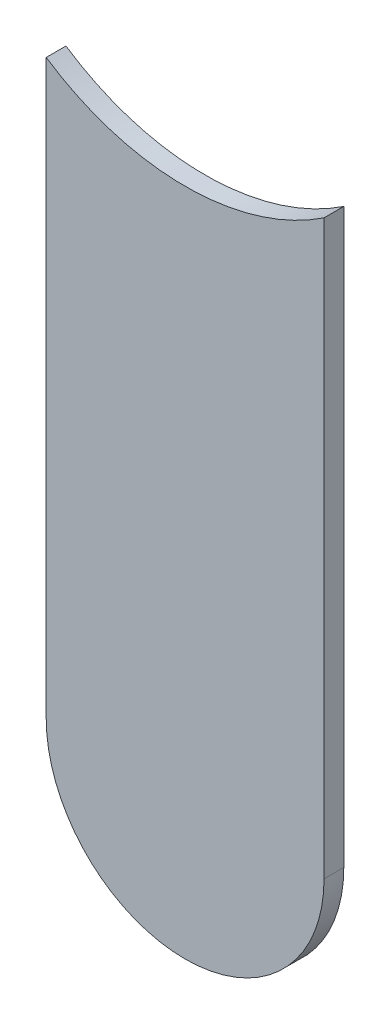
ISO-10303-21;
HEADER;
FILE_DESCRIPTION(('STEP AP214'),'2;1');
FILE_NAME('part.step','',(''),(''),'','','');
FILE_SCHEMA(('AUTOMOTIVE_DESIGN { 1 0 10303 214 1 1 1 1 }'));
ENDSEC;
DATA;
#1=APPLICATION_CONTEXT('core data for automotive mechanical design processes');
#2=APPLICATION_PROTOCOL_DEFINITION('international standard','automotive_design',2000,#1);
#3=PRODUCT_CONTEXT('',#1,'mechanical');
#4=PRODUCT('Part','Part','',(#3));
#5=PRODUCT_RELATED_PRODUCT_CATEGORY('part','',(#4));
#6=PRODUCT_DEFINITION_FORMATION('','',#4);
#7=PRODUCT_DEFINITION_CONTEXT('part definition',#1,'design');
#8=PRODUCT_DEFINITION('design','',#6,#7);
#9=PRODUCT_DEFINITION_SHAPE('','',#8);
#10=(LENGTH_UNIT() NAMED_UNIT(*) SI_UNIT(.MILLI.,.METRE.));
#11=(NAMED_UNIT(*) PLANE_ANGLE_UNIT() SI_UNIT($,.RADIAN.));
#12=(NAMED_UNIT(*) SI_UNIT($,.STERADIAN.) SOLID_ANGLE_UNIT());
#13=UNCERTAINTY_MEASURE_WITH_UNIT(LENGTH_MEASURE(1.E-05),#10,'distance_accuracy_value','');
#14=(GEOMETRIC_REPRESENTATION_CONTEXT(3) GLOBAL_UNCERTAINTY_ASSIGNED_CONTEXT((#13)) GLOBAL_UNIT_ASSIGNED_CONTEXT((#10,
#11,#12)) REPRESENTATION_CONTEXT('',''));
#15=CARTESIAN_POINT('',(0.,0.,0.));
#16=DIRECTION('',(0.,0.,1.));
#17=DIRECTION('',(1.,0.,0.));
#18=AXIS2_PLACEMENT_3D('',#15,#16,#17);
#19=CARTESIAN_POINT('',(114.6500247,115.0955788,0.));
#20=DIRECTION('',(-1.,0.,0.));
#21=DIRECTION('',(0.,1.,0.));
#22=AXIS2_PLACEMENT_3D('',#19,#20,#21);
#23=PLANE('',#22);
#24=DIRECTION('',(0.,1.,0.));
#25=VECTOR('',#24,1.);
#26=CARTESIAN_POINT('',(114.6500247,115.0955788,0.03556));
#27=LINE('',#26,#25);
#28=CARTESIAN_POINT('',(114.6500247,115.0955788,0.03556));
#29=VERTEX_POINT('',#28);
#30=CARTESIAN_POINT('',(114.6500247,116.125830609654,0.03556));
#31=VERTEX_POINT('',#30);
#32=EDGE_CURVE('E11',#29,#31,#27,.T.);
#33=ORIENTED_EDGE('',*,*,#32,.F.);
#34=DIRECTION('',(0.,0.,1.));
#35=VECTOR('',#34,1.);
#36=CARTESIAN_POINT('',(114.6500247,115.0955788,0.));
#37=LINE('',#36,#35);
#38=CARTESIAN_POINT('',(114.6500247,115.0955788,0.));
#39=VERTEX_POINT('',#38);
#40=EDGE_CURVE('E24',#39,#29,#37,.T.);
#41=ORIENTED_EDGE('',*,*,#40,.F.);
#42=DIRECTION('',(0.,1.,0.));
#43=VECTOR('',#42,1.);
#44=CARTESIAN_POINT('',(114.6500247,115.0955788,0.));
#45=LINE('',#44,#43);
#46=CARTESIAN_POINT('',(114.6500247,116.125830609654,0.));
#47=VERTEX_POINT('',#46);
#48=EDGE_CURVE('E75',#39,#47,#45,.T.);
#49=ORIENTED_EDGE('',*,*,#48,.T.);
#50=DIRECTION('',(0.,0.,1.));
#51=VECTOR('',#50,1.);
#52=CARTESIAN_POINT('',(114.6500247,116.125830609654,0.));
#53=LINE('',#52,#51);
#54=EDGE_CURVE('E37',#47,#31,#53,.T.);
#55=ORIENTED_EDGE('',*,*,#54,.T.);
#56=EDGE_LOOP('',(#33,#41,#49,#55));
#57=FACE_BOUND('',#56,.T.);
#58=ADVANCED_FACE('F17',(#57),#23,.F.);
#59=CARTESIAN_POINT('',(114.4000252,116.4999956,0.));
#60=DIRECTION('',(0.,0.,-1.));
#61=DIRECTION('',(1.,0.,0.));
#62=AXIS2_PLACEMENT_3D('',#59,#60,#61);
#63=CYLINDRICAL_SURFACE('',#62,0.4499991);
#64=DIRECTION('',(0.,0.,1.));
#65=VECTOR('',#64,1.);
#66=CARTESIAN_POINT('',(114.1500257,116.125830609654,0.));
#67=LINE('',#66,#65);
#68=CARTESIAN_POINT('',(114.1500257,116.125830609654,0.));
#69=VERTEX_POINT('',#68);
#70=CARTESIAN_POINT('',(114.1500257,116.125830609654,0.03556));
#71=VERTEX_POINT('',#70);
#72=EDGE_CURVE('E67',#69,#71,#67,.T.);
#73=ORIENTED_EDGE('',*,*,#72,.T.);
#74=CARTESIAN_POINT('',(114.4000252,116.4999956,0.03556));
#75=DIRECTION('',(0.,0.,1.));
#76=DIRECTION('',(1.,0.,0.));
#77=AXIS2_PLACEMENT_3D('',#74,#75,#76);
#78=CIRCLE('',#77,0.4499991);
#79=EDGE_CURVE('E82',#71,#31,#78,.T.);
#80=ORIENTED_EDGE('',*,*,#79,.T.);
#81=ORIENTED_EDGE('',*,*,#54,.F.);
#82=CARTESIAN_POINT('',(114.4000252,116.4999956,0.));
#83=DIRECTION('',(0.,0.,1.));
#84=DIRECTION('',(1.,0.,0.));
#85=AXIS2_PLACEMENT_3D('',#82,#83,#84);
#86=CIRCLE('',#85,0.4499991);
#87=EDGE_CURVE('E80',#69,#47,#86,.T.);
#88=ORIENTED_EDGE('',*,*,#87,.F.);
#89=EDGE_LOOP('',(#73,#80,#81,#88));
#90=FACE_BOUND('',#89,.T.);
#91=ADVANCED_FACE('F88',(#90),#63,.F.);
#92=CARTESIAN_POINT('',(114.1500257,116.125830609654,0.));
#93=DIRECTION('',(1.,0.,0.));
#94=DIRECTION('',(0.,-1.,0.));
#95=AXIS2_PLACEMENT_3D('',#92,#93,#94);
#96=PLANE('',#95);
#97=DIRECTION('',(0.,-1.,0.));
#98=VECTOR('',#97,1.);
#99=CARTESIAN_POINT('',(114.1500257,116.4999956,0.03556));
#100=LINE('',#99,#98);
#101=CARTESIAN_POINT('',(114.1500257,115.0955788,0.03556));
#102=VERTEX_POINT('',#101);
#103=EDGE_CURVE('E71',#71,#102,#100,.T.);
#104=ORIENTED_EDGE('',*,*,#103,.F.);
#105=ORIENTED_EDGE('',*,*,#72,.F.);
#106=DIRECTION('',(0.,-1.,0.));
#107=VECTOR('',#106,1.);
#108=CARTESIAN_POINT('',(114.1500257,116.4999956,0.));
#109=LINE('',#108,#107);
#110=CARTESIAN_POINT('',(114.1500257,115.0955788,0.));
#111=VERTEX_POINT('',#110);
#112=EDGE_CURVE('E63',#69,#111,#109,.T.);
#113=ORIENTED_EDGE('',*,*,#112,.T.);
#114=DIRECTION('',(0.,0.,1.));
#115=VECTOR('',#114,1.);
#116=CARTESIAN_POINT('',(114.1500257,115.0955788,0.));
#117=LINE('',#116,#115);
#118=EDGE_CURVE('E53',#111,#102,#117,.T.);
#119=ORIENTED_EDGE('',*,*,#118,.T.);
#120=EDGE_LOOP('',(#104,#105,#113,#119));
#121=FACE_BOUND('',#120,.T.);
#122=ADVANCED_FACE('F66',(#121),#96,.F.);
#123=CARTESIAN_POINT('',(114.4000252,115.0955788,0.));
#124=DIRECTION('',(0.,0.,-1.));
#125=DIRECTION('',(-1.,0.,0.));
#126=AXIS2_PLACEMENT_3D('',#123,#124,#125);
#127=CYLINDRICAL_SURFACE('',#126,0.249999500000001);
#128=CARTESIAN_POINT('',(114.4000252,115.0955788,0.03556));
#129=DIRECTION('',(0.,0.,1.));
#130=DIRECTION('',(-1.,0.,0.));
#131=AXIS2_PLACEMENT_3D('',#128,#129,#130);
#132=CIRCLE('',#131,0.249999500000001);
#133=EDGE_CURVE('E59',#102,#29,#132,.T.);
#134=ORIENTED_EDGE('',*,*,#133,.F.);
#135=ORIENTED_EDGE('',*,*,#118,.F.);
#136=CARTESIAN_POINT('',(114.4000252,115.0955788,0.));
#137=DIRECTION('',(0.,0.,1.));
#138=DIRECTION('',(-1.,0.,0.));
#139=AXIS2_PLACEMENT_3D('',#136,#137,#138);
#140=CIRCLE('',#139,0.249999500000001);
#141=EDGE_CURVE('E57',#111,#39,#140,.T.);
#142=ORIENTED_EDGE('',*,*,#141,.T.);
#143=ORIENTED_EDGE('',*,*,#40,.T.);
#144=EDGE_LOOP('',(#134,#135,#142,#143));
#145=FACE_BOUND('',#144,.T.);
#146=ADVANCED_FACE('F55',(#145),#127,.T.);
#147=CARTESIAN_POINT('',(114.6500247,115.0955788,0.));
#148=DIRECTION('',(0.,0.,-1.));
#149=DIRECTION('',(-1.,0.,0.));
#150=AXIS2_PLACEMENT_3D('',#147,#148,#149);
#151=PLANE('',#150);
#152=ORIENTED_EDGE('',*,*,#48,.F.);
#153=ORIENTED_EDGE('',*,*,#141,.F.);
#154=ORIENTED_EDGE('',*,*,#112,.F.);
#155=ORIENTED_EDGE('',*,*,#87,.T.);
#156=EDGE_LOOP('',(#152,#153,#154,#155));
#157=FACE_BOUND('',#156,.T.);
#158=ADVANCED_FACE('F74',(#157),#151,.T.);
#159=CARTESIAN_POINT('',(114.6500247,115.0955788,0.03556));
#160=DIRECTION('',(0.,0.,-1.));
#161=DIRECTION('',(-1.,0.,0.));
#162=AXIS2_PLACEMENT_3D('',#159,#160,#161);
#163=PLANE('',#162);
#164=ORIENTED_EDGE('',*,*,#133,.T.);
#165=ORIENTED_EDGE('',*,*,#32,.T.);
#166=ORIENTED_EDGE('',*,*,#79,.F.);
#167=ORIENTED_EDGE('',*,*,#103,.T.);
#168=EDGE_LOOP('',(#164,#165,#166,#167));
#169=FACE_BOUND('',#168,.T.);
#170=ADVANCED_FACE('F91',(#169),#163,.F.);
#171=CLOSED_SHELL('',(#58,#91,#122,#146,#158,#170));
#172=MANIFOLD_SOLID_BREP('B1',#171);
#173=ADVANCED_BREP_SHAPE_REPRESENTATION('',(#18,#172),#14);
#174=SHAPE_DEFINITION_REPRESENTATION(#9,#173);
ENDSEC;
END-ISO-10303-21;
